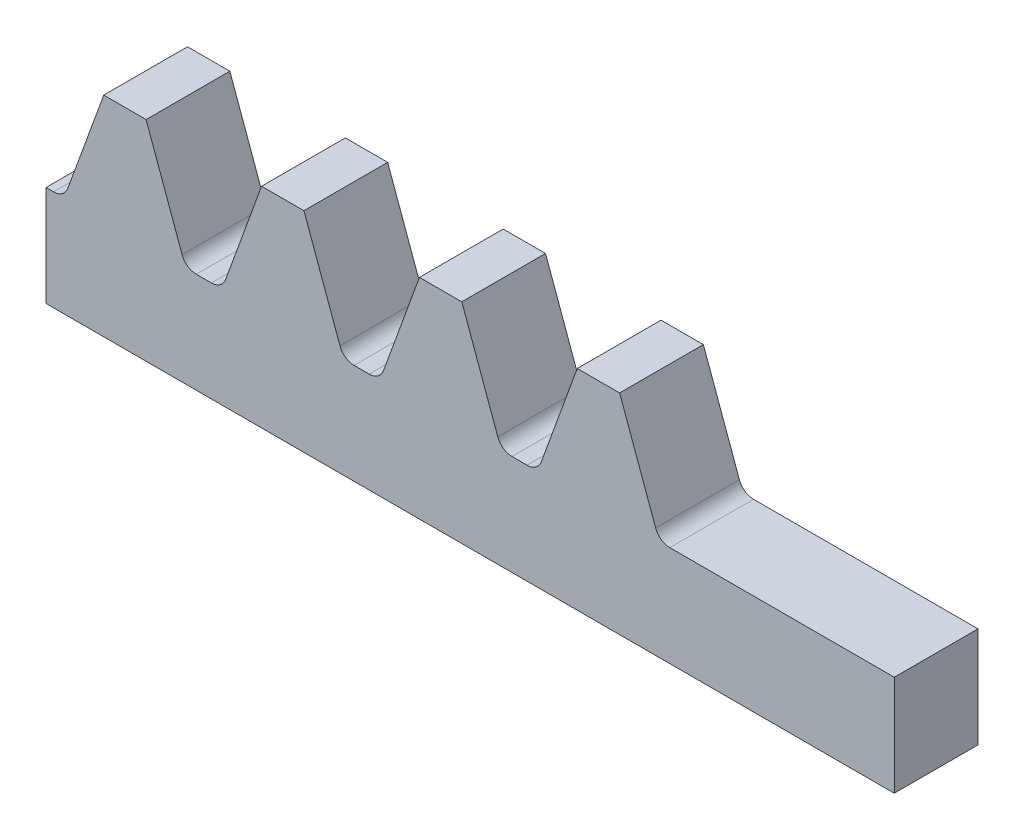
ISO-10303-21;
HEADER;
FILE_DESCRIPTION(('STEP AP214'),'2;1');
FILE_NAME('part.step','',(''),(''),'','','');
FILE_SCHEMA(('AUTOMOTIVE_DESIGN { 1 0 10303 214 1 1 1 1 }'));
ENDSEC;
DATA;
#1=APPLICATION_CONTEXT('core data for automotive mechanical design processes');
#2=APPLICATION_PROTOCOL_DEFINITION('international standard','automotive_design',2000,#1);
#3=PRODUCT_CONTEXT('',#1,'mechanical');
#4=PRODUCT('Part','Part','',(#3));
#5=PRODUCT_RELATED_PRODUCT_CATEGORY('part','',(#4));
#6=PRODUCT_DEFINITION_FORMATION('','',#4);
#7=PRODUCT_DEFINITION_CONTEXT('part definition',#1,'design');
#8=PRODUCT_DEFINITION('design','',#6,#7);
#9=PRODUCT_DEFINITION_SHAPE('','',#8);
#10=(LENGTH_UNIT() NAMED_UNIT(*) SI_UNIT(.MILLI.,.METRE.));
#11=(NAMED_UNIT(*) PLANE_ANGLE_UNIT() SI_UNIT($,.RADIAN.));
#12=(NAMED_UNIT(*) SI_UNIT($,.STERADIAN.) SOLID_ANGLE_UNIT());
#13=UNCERTAINTY_MEASURE_WITH_UNIT(LENGTH_MEASURE(1.E-05),#10,'distance_accuracy_value','');
#14=(GEOMETRIC_REPRESENTATION_CONTEXT(3) GLOBAL_UNCERTAINTY_ASSIGNED_CONTEXT((#13)) GLOBAL_UNIT_ASSIGNED_CONTEXT((#10,
#11,#12)) REPRESENTATION_CONTEXT('',''));
#15=CARTESIAN_POINT('',(0.,0.,0.));
#16=DIRECTION('',(0.,0.,1.));
#17=DIRECTION('',(1.,0.,0.));
#18=AXIS2_PLACEMENT_3D('',#15,#16,#17);
#19=CARTESIAN_POINT('',(111.771393149109,12.,10.));
#20=DIRECTION('',(0.,-1.,0.));
#21=DIRECTION('',(1.,0.,0.));
#22=AXIS2_PLACEMENT_3D('',#19,#20,#21);
#23=PLANE('',#22);
#24=DIRECTION('',(-1.,0.,0.));
#25=VECTOR('',#24,1.);
#26=CARTESIAN_POINT('',(111.771393149109,12.,0.));
#27=LINE('',#26,#25);
#28=CARTESIAN_POINT('',(138.578606850891,12.,0.));
#29=VERTEX_POINT('',#28);
#30=CARTESIAN_POINT('',(111.771393149109,12.,0.));
#31=VERTEX_POINT('',#30);
#32=EDGE_CURVE('E148',#29,#31,#27,.T.);
#33=ORIENTED_EDGE('',*,*,#32,.T.);
#34=DIRECTION('',(0.,0.,-1.));
#35=VECTOR('',#34,1.);
#36=CARTESIAN_POINT('',(111.771393149109,12.,10.));
#37=LINE('',#36,#35);
#38=CARTESIAN_POINT('',(111.771393149109,12.,10.));
#39=VERTEX_POINT('',#38);
#40=EDGE_CURVE('E11',#39,#31,#37,.T.);
#41=ORIENTED_EDGE('',*,*,#40,.F.);
#42=DIRECTION('',(-1.,0.,0.));
#43=VECTOR('',#42,1.);
#44=CARTESIAN_POINT('',(113.578606850891,12.,10.));
#45=LINE('',#44,#43);
#46=CARTESIAN_POINT('',(138.578606850891,12.,10.));
#47=VERTEX_POINT('',#46);
#48=EDGE_CURVE('E154',#47,#39,#45,.T.);
#49=ORIENTED_EDGE('',*,*,#48,.F.);
#50=DIRECTION('',(0.,0.,-1.));
#51=VECTOR('',#50,1.);
#52=CARTESIAN_POINT('',(138.578606850891,12.,10.));
#53=LINE('',#52,#51);
#54=EDGE_CURVE('E248',#47,#29,#53,.T.);
#55=ORIENTED_EDGE('',*,*,#54,.T.);
#56=EDGE_LOOP('',(#33,#41,#49,#55));
#57=FACE_BOUND('',#56,.T.);
#58=ADVANCED_FACE('F36',(#57),#23,.F.);
#59=CARTESIAN_POINT('',(111.771393149109,13.8,10.));
#60=DIRECTION('',(0.,0.,-1.));
#61=DIRECTION('',(-1.,0.,0.));
#62=AXIS2_PLACEMENT_3D('',#59,#60,#61);
#63=CYLINDRICAL_SURFACE('',#62,1.79999999999999);
#64=CARTESIAN_POINT('',(111.771393149109,13.8,0.));
#65=DIRECTION('',(0.,0.,-1.));
#66=DIRECTION('',(1.,0.,0.));
#67=AXIS2_PLACEMENT_3D('',#64,#65,#66);
#68=CIRCLE('',#67,1.79999999999999);
#69=CARTESIAN_POINT('',(110.079946431695,13.1843637420138,0.));
#70=VERTEX_POINT('',#69);
#71=EDGE_CURVE('E253',#31,#70,#68,.T.);
#72=ORIENTED_EDGE('',*,*,#71,.T.);
#73=DIRECTION('',(0.,0.,-1.));
#74=VECTOR('',#73,1.);
#75=CARTESIAN_POINT('',(110.079946431695,13.1843637420138,10.));
#76=LINE('',#75,#74);
#77=CARTESIAN_POINT('',(110.079946431695,13.1843637420138,10.));
#78=VERTEX_POINT('',#77);
#79=EDGE_CURVE('E44',#78,#70,#76,.T.);
#80=ORIENTED_EDGE('',*,*,#79,.F.);
#81=CARTESIAN_POINT('',(111.771393149109,13.8,10.));
#82=DIRECTION('',(0.,0.,-1.));
#83=DIRECTION('',(1.,0.,0.));
#84=AXIS2_PLACEMENT_3D('',#81,#82,#83);
#85=CIRCLE('',#84,1.79999999999999);
#86=EDGE_CURVE('E453',#39,#78,#85,.T.);
#87=ORIENTED_EDGE('',*,*,#86,.F.);
#88=ORIENTED_EDGE('',*,*,#40,.T.);
#89=EDGE_LOOP('',(#72,#80,#87,#88));
#90=FACE_BOUND('',#89,.T.);
#91=ADVANCED_FACE('F456',(#90),#63,.F.);
#92=CARTESIAN_POINT('',(105.778678594403,25.002,10.));
#93=DIRECTION('',(-0.93969262078591,-0.342020143325664,0.));
#94=DIRECTION('',(0.342020143325664,-0.93969262078591,0.));
#95=AXIS2_PLACEMENT_3D('',#92,#93,#94);
#96=PLANE('',#95);
#97=DIRECTION('',(-0.342020143325664,0.93969262078591,0.));
#98=VECTOR('',#97,1.);
#99=CARTESIAN_POINT('',(105.778678594403,25.002,0.));
#100=LINE('',#99,#98);
#101=CARTESIAN_POINT('',(105.778678594403,25.002,0.));
#102=VERTEX_POINT('',#101);
#103=EDGE_CURVE('E255',#70,#102,#100,.T.);
#104=ORIENTED_EDGE('',*,*,#103,.T.);
#105=DIRECTION('',(0.,0.,-1.));
#106=VECTOR('',#105,1.);
#107=CARTESIAN_POINT('',(105.778678594403,25.002,10.));
#108=LINE('',#107,#106);
#109=CARTESIAN_POINT('',(105.778678594403,25.002,10.));
#110=VERTEX_POINT('',#109);
#111=EDGE_CURVE('E372',#110,#102,#108,.T.);
#112=ORIENTED_EDGE('',*,*,#111,.F.);
#113=DIRECTION('',(-0.342020143325664,0.93969262078591,0.));
#114=VECTOR('',#113,1.);
#115=CARTESIAN_POINT('',(105.778678594403,25.002,10.));
#116=LINE('',#115,#114);
#117=EDGE_CURVE('E381',#78,#110,#116,.T.);
#118=ORIENTED_EDGE('',*,*,#117,.F.);
#119=ORIENTED_EDGE('',*,*,#79,.T.);
#120=EDGE_LOOP('',(#104,#112,#118,#119));
#121=FACE_BOUND('',#120,.T.);
#122=ADVANCED_FACE('F379',(#121),#96,.F.);
#123=CARTESIAN_POINT('',(100.721321405597,25.002,10.));
#124=DIRECTION('',(0.,-1.,0.));
#125=DIRECTION('',(1.,0.,0.));
#126=AXIS2_PLACEMENT_3D('',#123,#124,#125);
#127=PLANE('',#126);
#128=DIRECTION('',(-1.,0.,0.));
#129=VECTOR('',#128,1.);
#130=CARTESIAN_POINT('',(100.721321405597,25.002,0.));
#131=LINE('',#130,#129);
#132=CARTESIAN_POINT('',(100.721321405597,25.002,0.));
#133=VERTEX_POINT('',#132);
#134=EDGE_CURVE('E257',#102,#133,#131,.T.);
#135=ORIENTED_EDGE('',*,*,#134,.T.);
#136=DIRECTION('',(0.,0.,-1.));
#137=VECTOR('',#136,1.);
#138=CARTESIAN_POINT('',(100.721321405597,25.002,10.));
#139=LINE('',#138,#137);
#140=CARTESIAN_POINT('',(100.721321405597,25.002,10.));
#141=VERTEX_POINT('',#140);
#142=EDGE_CURVE('E369',#141,#133,#139,.T.);
#143=ORIENTED_EDGE('',*,*,#142,.F.);
#144=DIRECTION('',(-1.,0.,0.));
#145=VECTOR('',#144,1.);
#146=CARTESIAN_POINT('',(100.721321405597,25.002,10.));
#147=LINE('',#146,#145);
#148=EDGE_CURVE('E399',#110,#141,#147,.T.);
#149=ORIENTED_EDGE('',*,*,#148,.F.);
#150=ORIENTED_EDGE('',*,*,#111,.T.);
#151=EDGE_LOOP('',(#135,#143,#149,#150));
#152=FACE_BOUND('',#151,.T.);
#153=ADVANCED_FACE('F390',(#152),#127,.F.);
#154=CARTESIAN_POINT('',(100.721321405597,25.002,10.));
#155=DIRECTION('',(0.93969262078591,-0.342020143325664,0.));
#156=DIRECTION('',(0.342020143325664,0.93969262078591,0.));
#157=AXIS2_PLACEMENT_3D('',#154,#155,#156);
#158=PLANE('',#157);
#159=DIRECTION('',(-0.342020143325664,-0.93969262078591,0.));
#160=VECTOR('',#159,1.);
#161=CARTESIAN_POINT('',(100.721321405597,25.002,0.));
#162=LINE('',#161,#160);
#163=CARTESIAN_POINT('',(96.4200535683052,13.1843637420138,0.));
#164=VERTEX_POINT('',#163);
#165=EDGE_CURVE('E259',#133,#164,#162,.T.);
#166=ORIENTED_EDGE('',*,*,#165,.T.);
#167=DIRECTION('',(0.,0.,-1.));
#168=VECTOR('',#167,1.);
#169=CARTESIAN_POINT('',(96.4200535683052,13.1843637420138,10.));
#170=LINE('',#169,#168);
#171=CARTESIAN_POINT('',(96.4200535683052,13.1843637420138,10.));
#172=VERTEX_POINT('',#171);
#173=EDGE_CURVE('E366',#172,#164,#170,.T.);
#174=ORIENTED_EDGE('',*,*,#173,.F.);
#175=DIRECTION('',(-0.342020143325664,-0.93969262078591,0.));
#176=VECTOR('',#175,1.);
#177=CARTESIAN_POINT('',(100.721321405597,25.002,10.));
#178=LINE('',#177,#176);
#179=EDGE_CURVE('E396',#141,#172,#178,.T.);
#180=ORIENTED_EDGE('',*,*,#179,.F.);
#181=ORIENTED_EDGE('',*,*,#142,.T.);
#182=EDGE_LOOP('',(#166,#174,#180,#181));
#183=FACE_BOUND('',#182,.T.);
#184=ADVANCED_FACE('F394',(#183),#158,.F.);
#185=CARTESIAN_POINT('',(94.7286068508906,13.8,10.));
#186=DIRECTION('',(0.,0.,-1.));
#187=DIRECTION('',(-1.,0.,0.));
#188=AXIS2_PLACEMENT_3D('',#185,#186,#187);
#189=CYLINDRICAL_SURFACE('',#188,1.8);
#190=CARTESIAN_POINT('',(94.7286068508906,13.8,0.));
#191=DIRECTION('',(0.,0.,-1.));
#192=DIRECTION('',(-1.,0.,0.));
#193=AXIS2_PLACEMENT_3D('',#190,#191,#192);
#194=CIRCLE('',#193,1.8);
#195=CARTESIAN_POINT('',(94.7286068508906,12.,0.));
#196=VERTEX_POINT('',#195);
#197=EDGE_CURVE('E261',#164,#196,#194,.T.);
#198=ORIENTED_EDGE('',*,*,#197,.T.);
#199=DIRECTION('',(0.,0.,-1.));
#200=VECTOR('',#199,1.);
#201=CARTESIAN_POINT('',(94.7286068508906,12.,10.));
#202=LINE('',#201,#200);
#203=CARTESIAN_POINT('',(94.7286068508906,12.,10.));
#204=VERTEX_POINT('',#203);
#205=EDGE_CURVE('E363',#204,#196,#202,.T.);
#206=ORIENTED_EDGE('',*,*,#205,.F.);
#207=CARTESIAN_POINT('',(94.7286068508906,13.8,10.));
#208=DIRECTION('',(0.,0.,-1.));
#209=DIRECTION('',(-1.,0.,0.));
#210=AXIS2_PLACEMENT_3D('',#207,#208,#209);
#211=CIRCLE('',#210,1.8);
#212=EDGE_CURVE('E398',#172,#204,#211,.T.);
#213=ORIENTED_EDGE('',*,*,#212,.F.);
#214=ORIENTED_EDGE('',*,*,#173,.T.);
#215=EDGE_LOOP('',(#198,#206,#213,#214));
#216=FACE_BOUND('',#215,.T.);
#217=ADVANCED_FACE('F468',(#216),#189,.F.);
#218=CARTESIAN_POINT('',(92.9213931491094,12.,10.));
#219=DIRECTION('',(0.,-1.,0.));
#220=DIRECTION('',(1.,0.,0.));
#221=AXIS2_PLACEMENT_3D('',#218,#219,#220);
#222=PLANE('',#221);
#223=DIRECTION('',(-1.,0.,0.));
#224=VECTOR('',#223,1.);
#225=CARTESIAN_POINT('',(92.9213931491094,12.,0.));
#226=LINE('',#225,#224);
#227=CARTESIAN_POINT('',(92.9213931491094,12.,0.));
#228=VERTEX_POINT('',#227);
#229=EDGE_CURVE('E263',#196,#228,#226,.T.);
#230=ORIENTED_EDGE('',*,*,#229,.T.);
#231=DIRECTION('',(0.,0.,-1.));
#232=VECTOR('',#231,1.);
#233=CARTESIAN_POINT('',(92.9213931491094,12.,10.));
#234=LINE('',#233,#232);
#235=CARTESIAN_POINT('',(92.9213931491094,12.,10.));
#236=VERTEX_POINT('',#235);
#237=EDGE_CURVE('E360',#236,#228,#234,.T.);
#238=ORIENTED_EDGE('',*,*,#237,.F.);
#239=DIRECTION('',(-1.,0.,0.));
#240=VECTOR('',#239,1.);
#241=CARTESIAN_POINT('',(92.9213931491094,12.,10.));
#242=LINE('',#241,#240);
#243=EDGE_CURVE('E401',#204,#236,#242,.T.);
#244=ORIENTED_EDGE('',*,*,#243,.F.);
#245=ORIENTED_EDGE('',*,*,#205,.T.);
#246=EDGE_LOOP('',(#230,#238,#244,#245));
#247=FACE_BOUND('',#246,.T.);
#248=ADVANCED_FACE('F471',(#247),#222,.F.);
#249=CARTESIAN_POINT('',(92.9213931491094,13.8,10.));
#250=DIRECTION('',(0.,0.,-1.));
#251=DIRECTION('',(-1.,0.,0.));
#252=AXIS2_PLACEMENT_3D('',#249,#250,#251);
#253=CYLINDRICAL_SURFACE('',#252,1.79999999999999);
#254=CARTESIAN_POINT('',(92.9213931491094,13.8,0.));
#255=DIRECTION('',(0.,0.,-1.));
#256=DIRECTION('',(1.,0.,0.));
#257=AXIS2_PLACEMENT_3D('',#254,#255,#256);
#258=CIRCLE('',#257,1.79999999999999);
#259=CARTESIAN_POINT('',(91.2299464316947,13.1843637420138,0.));
#260=VERTEX_POINT('',#259);
#261=EDGE_CURVE('E265',#228,#260,#258,.T.);
#262=ORIENTED_EDGE('',*,*,#261,.T.);
#263=DIRECTION('',(0.,0.,-1.));
#264=VECTOR('',#263,1.);
#265=CARTESIAN_POINT('',(91.2299464316947,13.1843637420138,10.));
#266=LINE('',#265,#264);
#267=CARTESIAN_POINT('',(91.2299464316947,13.1843637420138,10.));
#268=VERTEX_POINT('',#267);
#269=EDGE_CURVE('E357',#268,#260,#266,.T.);
#270=ORIENTED_EDGE('',*,*,#269,.F.);
#271=CARTESIAN_POINT('',(92.9213931491094,13.8,10.));
#272=DIRECTION('',(0.,0.,-1.));
#273=DIRECTION('',(1.,0.,0.));
#274=AXIS2_PLACEMENT_3D('',#271,#272,#273);
#275=CIRCLE('',#274,1.79999999999999);
#276=EDGE_CURVE('E407',#236,#268,#275,.T.);
#277=ORIENTED_EDGE('',*,*,#276,.F.);
#278=ORIENTED_EDGE('',*,*,#237,.T.);
#279=EDGE_LOOP('',(#262,#270,#277,#278));
#280=FACE_BOUND('',#279,.T.);
#281=ADVANCED_FACE('F475',(#280),#253,.F.);
#282=CARTESIAN_POINT('',(86.9286785944028,25.002,10.));
#283=DIRECTION('',(-0.93969262078591,-0.342020143325664,0.));
#284=DIRECTION('',(0.342020143325664,-0.93969262078591,0.));
#285=AXIS2_PLACEMENT_3D('',#282,#283,#284);
#286=PLANE('',#285);
#287=DIRECTION('',(-0.342020143325664,0.93969262078591,0.));
#288=VECTOR('',#287,1.);
#289=CARTESIAN_POINT('',(86.9286785944028,25.002,0.));
#290=LINE('',#289,#288);
#291=CARTESIAN_POINT('',(86.9286785944028,25.002,0.));
#292=VERTEX_POINT('',#291);
#293=EDGE_CURVE('E267',#260,#292,#290,.T.);
#294=ORIENTED_EDGE('',*,*,#293,.T.);
#295=DIRECTION('',(0.,0.,-1.));
#296=VECTOR('',#295,1.);
#297=CARTESIAN_POINT('',(86.9286785944028,25.002,10.));
#298=LINE('',#297,#296);
#299=CARTESIAN_POINT('',(86.9286785944028,25.002,10.));
#300=VERTEX_POINT('',#299);
#301=EDGE_CURVE('E354',#300,#292,#298,.T.);
#302=ORIENTED_EDGE('',*,*,#301,.F.);
#303=DIRECTION('',(-0.342020143325664,0.93969262078591,0.));
#304=VECTOR('',#303,1.);
#305=CARTESIAN_POINT('',(86.9286785944028,25.002,10.));
#306=LINE('',#305,#304);
#307=EDGE_CURVE('E409',#268,#300,#306,.T.);
#308=ORIENTED_EDGE('',*,*,#307,.F.);
#309=ORIENTED_EDGE('',*,*,#269,.T.);
#310=EDGE_LOOP('',(#294,#302,#308,#309));
#311=FACE_BOUND('',#310,.T.);
#312=ADVANCED_FACE('F479',(#311),#286,.F.);
#313=CARTESIAN_POINT('',(81.8713214055972,25.002,10.));
#314=DIRECTION('',(0.,-1.,0.));
#315=DIRECTION('',(1.,0.,0.));
#316=AXIS2_PLACEMENT_3D('',#313,#314,#315);
#317=PLANE('',#316);
#318=DIRECTION('',(-1.,0.,0.));
#319=VECTOR('',#318,1.);
#320=CARTESIAN_POINT('',(81.8713214055972,25.002,0.));
#321=LINE('',#320,#319);
#322=CARTESIAN_POINT('',(81.8713214055972,25.002,0.));
#323=VERTEX_POINT('',#322);
#324=EDGE_CURVE('E269',#292,#323,#321,.T.);
#325=ORIENTED_EDGE('',*,*,#324,.T.);
#326=DIRECTION('',(0.,0.,-1.));
#327=VECTOR('',#326,1.);
#328=CARTESIAN_POINT('',(81.8713214055972,25.002,10.));
#329=LINE('',#328,#327);
#330=CARTESIAN_POINT('',(81.8713214055972,25.002,10.));
#331=VERTEX_POINT('',#330);
#332=EDGE_CURVE('E351',#331,#323,#329,.T.);
#333=ORIENTED_EDGE('',*,*,#332,.F.);
#334=DIRECTION('',(-1.,0.,0.));
#335=VECTOR('',#334,1.);
#336=CARTESIAN_POINT('',(81.8713214055972,25.002,10.));
#337=LINE('',#336,#335);
#338=EDGE_CURVE('E411',#300,#331,#337,.T.);
#339=ORIENTED_EDGE('',*,*,#338,.F.);
#340=ORIENTED_EDGE('',*,*,#301,.T.);
#341=EDGE_LOOP('',(#325,#333,#339,#340));
#342=FACE_BOUND('',#341,.T.);
#343=ADVANCED_FACE('F483',(#342),#317,.F.);
#344=CARTESIAN_POINT('',(81.8713214055972,25.002,10.));
#345=DIRECTION('',(0.93969262078591,-0.342020143325664,0.));
#346=DIRECTION('',(0.342020143325664,0.93969262078591,0.));
#347=AXIS2_PLACEMENT_3D('',#344,#345,#346);
#348=PLANE('',#347);
#349=DIRECTION('',(-0.342020143325664,-0.93969262078591,0.));
#350=VECTOR('',#349,1.);
#351=CARTESIAN_POINT('',(81.8713214055972,25.002,0.));
#352=LINE('',#351,#350);
#353=CARTESIAN_POINT('',(77.5700535683052,13.1843637420138,0.));
#354=VERTEX_POINT('',#353);
#355=EDGE_CURVE('E271',#323,#354,#352,.T.);
#356=ORIENTED_EDGE('',*,*,#355,.T.);
#357=DIRECTION('',(0.,0.,-1.));
#358=VECTOR('',#357,1.);
#359=CARTESIAN_POINT('',(77.5700535683052,13.1843637420138,10.));
#360=LINE('',#359,#358);
#361=CARTESIAN_POINT('',(77.5700535683052,13.1843637420138,10.));
#362=VERTEX_POINT('',#361);
#363=EDGE_CURVE('E348',#362,#354,#360,.T.);
#364=ORIENTED_EDGE('',*,*,#363,.F.);
#365=DIRECTION('',(-0.342020143325664,-0.93969262078591,0.));
#366=VECTOR('',#365,1.);
#367=CARTESIAN_POINT('',(81.8713214055972,25.002,10.));
#368=LINE('',#367,#366);
#369=EDGE_CURVE('E413',#331,#362,#368,.T.);
#370=ORIENTED_EDGE('',*,*,#369,.F.);
#371=ORIENTED_EDGE('',*,*,#332,.T.);
#372=EDGE_LOOP('',(#356,#364,#370,#371));
#373=FACE_BOUND('',#372,.T.);
#374=ADVANCED_FACE('F487',(#373),#348,.F.);
#375=CARTESIAN_POINT('',(75.8786068508906,13.8,10.));
#376=DIRECTION('',(0.,0.,-1.));
#377=DIRECTION('',(-1.,0.,0.));
#378=AXIS2_PLACEMENT_3D('',#375,#376,#377);
#379=CYLINDRICAL_SURFACE('',#378,1.8);
#380=CARTESIAN_POINT('',(75.8786068508906,13.8,0.));
#381=DIRECTION('',(0.,0.,-1.));
#382=DIRECTION('',(-1.,0.,0.));
#383=AXIS2_PLACEMENT_3D('',#380,#381,#382);
#384=CIRCLE('',#383,1.8);
#385=CARTESIAN_POINT('',(75.8786068508906,12.,0.));
#386=VERTEX_POINT('',#385);
#387=EDGE_CURVE('E273',#354,#386,#384,.T.);
#388=ORIENTED_EDGE('',*,*,#387,.T.);
#389=DIRECTION('',(0.,0.,-1.));
#390=VECTOR('',#389,1.);
#391=CARTESIAN_POINT('',(75.8786068508906,12.,10.));
#392=LINE('',#391,#390);
#393=CARTESIAN_POINT('',(75.8786068508906,12.,10.));
#394=VERTEX_POINT('',#393);
#395=EDGE_CURVE('E345',#394,#386,#392,.T.);
#396=ORIENTED_EDGE('',*,*,#395,.F.);
#397=CARTESIAN_POINT('',(75.8786068508906,13.8,10.));
#398=DIRECTION('',(0.,0.,-1.));
#399=DIRECTION('',(-1.,0.,0.));
#400=AXIS2_PLACEMENT_3D('',#397,#398,#399);
#401=CIRCLE('',#400,1.8);
#402=EDGE_CURVE('E415',#362,#394,#401,.T.);
#403=ORIENTED_EDGE('',*,*,#402,.F.);
#404=ORIENTED_EDGE('',*,*,#363,.T.);
#405=EDGE_LOOP('',(#388,#396,#403,#404));
#406=FACE_BOUND('',#405,.T.);
#407=ADVANCED_FACE('F491',(#406),#379,.F.);
#408=CARTESIAN_POINT('',(74.0713931491094,12.,10.));
#409=DIRECTION('',(0.,-1.,0.));
#410=DIRECTION('',(1.,0.,0.));
#411=AXIS2_PLACEMENT_3D('',#408,#409,#410);
#412=PLANE('',#411);
#413=DIRECTION('',(-1.,0.,0.));
#414=VECTOR('',#413,1.);
#415=CARTESIAN_POINT('',(74.0713931491094,12.,0.));
#416=LINE('',#415,#414);
#417=CARTESIAN_POINT('',(74.0713931491094,12.,0.));
#418=VERTEX_POINT('',#417);
#419=EDGE_CURVE('E275',#386,#418,#416,.T.);
#420=ORIENTED_EDGE('',*,*,#419,.T.);
#421=DIRECTION('',(0.,0.,-1.));
#422=VECTOR('',#421,1.);
#423=CARTESIAN_POINT('',(74.0713931491094,12.,10.));
#424=LINE('',#423,#422);
#425=CARTESIAN_POINT('',(74.0713931491094,12.,10.));
#426=VERTEX_POINT('',#425);
#427=EDGE_CURVE('E342',#426,#418,#424,.T.);
#428=ORIENTED_EDGE('',*,*,#427,.F.);
#429=DIRECTION('',(-1.,0.,0.));
#430=VECTOR('',#429,1.);
#431=CARTESIAN_POINT('',(74.0713931491094,12.,10.));
#432=LINE('',#431,#430);
#433=EDGE_CURVE('E417',#394,#426,#432,.T.);
#434=ORIENTED_EDGE('',*,*,#433,.F.);
#435=ORIENTED_EDGE('',*,*,#395,.T.);
#436=EDGE_LOOP('',(#420,#428,#434,#435));
#437=FACE_BOUND('',#436,.T.);
#438=ADVANCED_FACE('F495',(#437),#412,.F.);
#439=CARTESIAN_POINT('',(74.0713931491094,13.8,10.));
#440=DIRECTION('',(0.,0.,-1.));
#441=DIRECTION('',(-1.,0.,0.));
#442=AXIS2_PLACEMENT_3D('',#439,#440,#441);
#443=CYLINDRICAL_SURFACE('',#442,1.8);
#444=CARTESIAN_POINT('',(74.0713931491094,13.8,0.));
#445=DIRECTION('',(0.,0.,-1.));
#446=DIRECTION('',(1.,0.,0.));
#447=AXIS2_PLACEMENT_3D('',#444,#445,#446);
#448=CIRCLE('',#447,1.8);
#449=CARTESIAN_POINT('',(72.3799464316947,13.1843637420138,0.));
#450=VERTEX_POINT('',#449);
#451=EDGE_CURVE('E277',#418,#450,#448,.T.);
#452=ORIENTED_EDGE('',*,*,#451,.T.);
#453=DIRECTION('',(0.,0.,-1.));
#454=VECTOR('',#453,1.);
#455=CARTESIAN_POINT('',(72.3799464316947,13.1843637420138,10.));
#456=LINE('',#455,#454);
#457=CARTESIAN_POINT('',(72.3799464316947,13.1843637420138,10.));
#458=VERTEX_POINT('',#457);
#459=EDGE_CURVE('E339',#458,#450,#456,.T.);
#460=ORIENTED_EDGE('',*,*,#459,.F.);
#461=CARTESIAN_POINT('',(74.0713931491094,13.8,10.));
#462=DIRECTION('',(0.,0.,-1.));
#463=DIRECTION('',(1.,0.,0.));
#464=AXIS2_PLACEMENT_3D('',#461,#462,#463);
#465=CIRCLE('',#464,1.8);
#466=EDGE_CURVE('E419',#426,#458,#465,.T.);
#467=ORIENTED_EDGE('',*,*,#466,.F.);
#468=ORIENTED_EDGE('',*,*,#427,.T.);
#469=EDGE_LOOP('',(#452,#460,#467,#468));
#470=FACE_BOUND('',#469,.T.);
#471=ADVANCED_FACE('F499',(#470),#443,.F.);
#472=CARTESIAN_POINT('',(68.0786785944028,25.002,10.));
#473=DIRECTION('',(-0.93969262078591,-0.342020143325663,0.));
#474=DIRECTION('',(0.342020143325663,-0.939692620785911,0.));
#475=AXIS2_PLACEMENT_3D('',#472,#473,#474);
#476=PLANE('',#475);
#477=DIRECTION('',(-0.342020143325663,0.939692620785911,0.));
#478=VECTOR('',#477,1.);
#479=CARTESIAN_POINT('',(68.0786785944028,25.002,0.));
#480=LINE('',#479,#478);
#481=CARTESIAN_POINT('',(68.0786785944028,25.002,0.));
#482=VERTEX_POINT('',#481);
#483=EDGE_CURVE('E279',#450,#482,#480,.T.);
#484=ORIENTED_EDGE('',*,*,#483,.T.);
#485=DIRECTION('',(0.,0.,-1.));
#486=VECTOR('',#485,1.);
#487=CARTESIAN_POINT('',(68.0786785944028,25.002,10.));
#488=LINE('',#487,#486);
#489=CARTESIAN_POINT('',(68.0786785944028,25.002,10.));
#490=VERTEX_POINT('',#489);
#491=EDGE_CURVE('E336',#490,#482,#488,.T.);
#492=ORIENTED_EDGE('',*,*,#491,.F.);
#493=DIRECTION('',(-0.342020143325663,0.939692620785911,0.));
#494=VECTOR('',#493,1.);
#495=CARTESIAN_POINT('',(68.0786785944028,25.002,10.));
#496=LINE('',#495,#494);
#497=EDGE_CURVE('E421',#458,#490,#496,.T.);
#498=ORIENTED_EDGE('',*,*,#497,.F.);
#499=ORIENTED_EDGE('',*,*,#459,.T.);
#500=EDGE_LOOP('',(#484,#492,#498,#499));
#501=FACE_BOUND('',#500,.T.);
#502=ADVANCED_FACE('F503',(#501),#476,.F.);
#503=CARTESIAN_POINT('',(63.0213214055972,25.002,10.));
#504=DIRECTION('',(0.,-1.,0.));
#505=DIRECTION('',(1.,0.,0.));
#506=AXIS2_PLACEMENT_3D('',#503,#504,#505);
#507=PLANE('',#506);
#508=DIRECTION('',(-1.,0.,0.));
#509=VECTOR('',#508,1.);
#510=CARTESIAN_POINT('',(63.0213214055972,25.002,0.));
#511=LINE('',#510,#509);
#512=CARTESIAN_POINT('',(63.0213214055972,25.002,0.));
#513=VERTEX_POINT('',#512);
#514=EDGE_CURVE('E281',#482,#513,#511,.T.);
#515=ORIENTED_EDGE('',*,*,#514,.T.);
#516=DIRECTION('',(0.,0.,-1.));
#517=VECTOR('',#516,1.);
#518=CARTESIAN_POINT('',(63.0213214055972,25.002,10.));
#519=LINE('',#518,#517);
#520=CARTESIAN_POINT('',(63.0213214055972,25.002,10.));
#521=VERTEX_POINT('',#520);
#522=EDGE_CURVE('E333',#521,#513,#519,.T.);
#523=ORIENTED_EDGE('',*,*,#522,.F.);
#524=DIRECTION('',(-1.,0.,0.));
#525=VECTOR('',#524,1.);
#526=CARTESIAN_POINT('',(63.0213214055972,25.002,10.));
#527=LINE('',#526,#525);
#528=EDGE_CURVE('E423',#490,#521,#527,.T.);
#529=ORIENTED_EDGE('',*,*,#528,.F.);
#530=ORIENTED_EDGE('',*,*,#491,.T.);
#531=EDGE_LOOP('',(#515,#523,#529,#530));
#532=FACE_BOUND('',#531,.T.);
#533=ADVANCED_FACE('F507',(#532),#507,.F.);
#534=CARTESIAN_POINT('',(63.0213214055972,25.002,10.));
#535=DIRECTION('',(0.939692620785911,-0.342020143325662,0.));
#536=DIRECTION('',(0.342020143325662,0.939692620785911,0.));
#537=AXIS2_PLACEMENT_3D('',#534,#535,#536);
#538=PLANE('',#537);
#539=DIRECTION('',(-0.342020143325662,-0.939692620785911,0.));
#540=VECTOR('',#539,1.);
#541=CARTESIAN_POINT('',(63.0213214055972,25.002,0.));
#542=LINE('',#541,#540);
#543=CARTESIAN_POINT('',(58.7200535683053,13.1843637420138,0.));
#544=VERTEX_POINT('',#543);
#545=EDGE_CURVE('E283',#513,#544,#542,.T.);
#546=ORIENTED_EDGE('',*,*,#545,.T.);
#547=DIRECTION('',(0.,0.,-1.));
#548=VECTOR('',#547,1.);
#549=CARTESIAN_POINT('',(58.7200535683053,13.1843637420138,10.));
#550=LINE('',#549,#548);
#551=CARTESIAN_POINT('',(58.7200535683053,13.1843637420138,10.));
#552=VERTEX_POINT('',#551);
#553=EDGE_CURVE('E330',#552,#544,#550,.T.);
#554=ORIENTED_EDGE('',*,*,#553,.F.);
#555=DIRECTION('',(-0.342020143325662,-0.939692620785911,0.));
#556=VECTOR('',#555,1.);
#557=CARTESIAN_POINT('',(63.0213214055972,25.002,10.));
#558=LINE('',#557,#556);
#559=EDGE_CURVE('E425',#521,#552,#558,.T.);
#560=ORIENTED_EDGE('',*,*,#559,.F.);
#561=ORIENTED_EDGE('',*,*,#522,.T.);
#562=EDGE_LOOP('',(#546,#554,#560,#561));
#563=FACE_BOUND('',#562,.T.);
#564=ADVANCED_FACE('F511',(#563),#538,.F.);
#565=CARTESIAN_POINT('',(57.0286068508906,13.8,10.));
#566=DIRECTION('',(0.,0.,-1.));
#567=DIRECTION('',(-1.,0.,0.));
#568=AXIS2_PLACEMENT_3D('',#565,#566,#567);
#569=CYLINDRICAL_SURFACE('',#568,1.8);
#570=CARTESIAN_POINT('',(57.0286068508906,13.8,0.));
#571=DIRECTION('',(0.,0.,-1.));
#572=DIRECTION('',(-1.,0.,0.));
#573=AXIS2_PLACEMENT_3D('',#570,#571,#572);
#574=CIRCLE('',#573,1.8);
#575=CARTESIAN_POINT('',(57.0286068508906,12.,0.));
#576=VERTEX_POINT('',#575);
#577=EDGE_CURVE('E285',#544,#576,#574,.T.);
#578=ORIENTED_EDGE('',*,*,#577,.T.);
#579=DIRECTION('',(0.,0.,-1.));
#580=VECTOR('',#579,1.);
#581=CARTESIAN_POINT('',(57.0286068508906,12.,10.));
#582=LINE('',#581,#580);
#583=CARTESIAN_POINT('',(57.0286068508906,12.,10.));
#584=VERTEX_POINT('',#583);
#585=EDGE_CURVE('E327',#584,#576,#582,.T.);
#586=ORIENTED_EDGE('',*,*,#585,.F.);
#587=CARTESIAN_POINT('',(57.0286068508906,13.8,10.));
#588=DIRECTION('',(0.,0.,-1.));
#589=DIRECTION('',(-1.,0.,0.));
#590=AXIS2_PLACEMENT_3D('',#587,#588,#589);
#591=CIRCLE('',#590,1.8);
#592=EDGE_CURVE('E427',#552,#584,#591,.T.);
#593=ORIENTED_EDGE('',*,*,#592,.F.);
#594=ORIENTED_EDGE('',*,*,#553,.T.);
#595=EDGE_LOOP('',(#578,#586,#593,#594));
#596=FACE_BOUND('',#595,.T.);
#597=ADVANCED_FACE('F515',(#596),#569,.F.);
#598=CARTESIAN_POINT('',(55.2213931491094,12.,10.));
#599=DIRECTION('',(0.,-1.,0.));
#600=DIRECTION('',(1.,0.,0.));
#601=AXIS2_PLACEMENT_3D('',#598,#599,#600);
#602=PLANE('',#601);
#603=DIRECTION('',(-1.,0.,0.));
#604=VECTOR('',#603,1.);
#605=CARTESIAN_POINT('',(55.2213931491094,12.,0.));
#606=LINE('',#605,#604);
#607=CARTESIAN_POINT('',(55.2213931491094,12.,0.));
#608=VERTEX_POINT('',#607);
#609=EDGE_CURVE('E287',#576,#608,#606,.T.);
#610=ORIENTED_EDGE('',*,*,#609,.T.);
#611=DIRECTION('',(0.,0.,-1.));
#612=VECTOR('',#611,1.);
#613=CARTESIAN_POINT('',(55.2213931491094,12.,10.));
#614=LINE('',#613,#612);
#615=CARTESIAN_POINT('',(55.2213931491094,12.,10.));
#616=VERTEX_POINT('',#615);
#617=EDGE_CURVE('E324',#616,#608,#614,.T.);
#618=ORIENTED_EDGE('',*,*,#617,.F.);
#619=DIRECTION('',(-1.,0.,0.));
#620=VECTOR('',#619,1.);
#621=CARTESIAN_POINT('',(55.2213931491094,12.,10.));
#622=LINE('',#621,#620);
#623=EDGE_CURVE('E429',#584,#616,#622,.T.);
#624=ORIENTED_EDGE('',*,*,#623,.F.);
#625=ORIENTED_EDGE('',*,*,#585,.T.);
#626=EDGE_LOOP('',(#610,#618,#624,#625));
#627=FACE_BOUND('',#626,.T.);
#628=ADVANCED_FACE('F519',(#627),#602,.F.);
#629=CARTESIAN_POINT('',(55.2213931491094,13.8,10.));
#630=DIRECTION('',(0.,0.,-1.));
#631=DIRECTION('',(-1.,0.,0.));
#632=AXIS2_PLACEMENT_3D('',#629,#630,#631);
#633=CYLINDRICAL_SURFACE('',#632,1.8);
#634=CARTESIAN_POINT('',(55.2213931491094,13.8,0.));
#635=DIRECTION('',(0.,0.,-1.));
#636=DIRECTION('',(1.,0.,0.));
#637=AXIS2_PLACEMENT_3D('',#634,#635,#636);
#638=CIRCLE('',#637,1.8);
#639=CARTESIAN_POINT('',(53.5299464316947,13.1843637420138,0.));
#640=VERTEX_POINT('',#639);
#641=EDGE_CURVE('E289',#608,#640,#638,.T.);
#642=ORIENTED_EDGE('',*,*,#641,.T.);
#643=DIRECTION('',(0.,0.,-1.));
#644=VECTOR('',#643,1.);
#645=CARTESIAN_POINT('',(53.5299464316947,13.1843637420138,10.));
#646=LINE('',#645,#644);
#647=CARTESIAN_POINT('',(53.5299464316947,13.1843637420138,10.));
#648=VERTEX_POINT('',#647);
#649=EDGE_CURVE('E321',#648,#640,#646,.T.);
#650=ORIENTED_EDGE('',*,*,#649,.F.);
#651=CARTESIAN_POINT('',(55.2213931491094,13.8,10.));
#652=DIRECTION('',(0.,0.,-1.));
#653=DIRECTION('',(1.,0.,0.));
#654=AXIS2_PLACEMENT_3D('',#651,#652,#653);
#655=CIRCLE('',#654,1.8);
#656=EDGE_CURVE('E431',#616,#648,#655,.T.);
#657=ORIENTED_EDGE('',*,*,#656,.F.);
#658=ORIENTED_EDGE('',*,*,#617,.T.);
#659=EDGE_LOOP('',(#642,#650,#657,#658));
#660=FACE_BOUND('',#659,.T.);
#661=ADVANCED_FACE('F523',(#660),#633,.F.);
#662=CARTESIAN_POINT('',(49.2286785944028,25.002,10.));
#663=DIRECTION('',(-0.93969262078591,-0.342020143325663,0.));
#664=DIRECTION('',(0.342020143325663,-0.93969262078591,0.));
#665=AXIS2_PLACEMENT_3D('',#662,#663,#664);
#666=PLANE('',#665);
#667=DIRECTION('',(-0.342020143325663,0.93969262078591,0.));
#668=VECTOR('',#667,1.);
#669=CARTESIAN_POINT('',(49.2286785944028,25.002,0.));
#670=LINE('',#669,#668);
#671=CARTESIAN_POINT('',(49.2286785944028,25.002,0.));
#672=VERTEX_POINT('',#671);
#673=EDGE_CURVE('E291',#640,#672,#670,.T.);
#674=ORIENTED_EDGE('',*,*,#673,.T.);
#675=DIRECTION('',(0.,0.,-1.));
#676=VECTOR('',#675,1.);
#677=CARTESIAN_POINT('',(49.2286785944028,25.002,10.));
#678=LINE('',#677,#676);
#679=CARTESIAN_POINT('',(49.2286785944028,25.002,10.));
#680=VERTEX_POINT('',#679);
#681=EDGE_CURVE('E318',#680,#672,#678,.T.);
#682=ORIENTED_EDGE('',*,*,#681,.F.);
#683=DIRECTION('',(-0.342020143325663,0.93969262078591,0.));
#684=VECTOR('',#683,1.);
#685=CARTESIAN_POINT('',(49.2286785944028,25.002,10.));
#686=LINE('',#685,#684);
#687=EDGE_CURVE('E433',#648,#680,#686,.T.);
#688=ORIENTED_EDGE('',*,*,#687,.F.);
#689=ORIENTED_EDGE('',*,*,#649,.T.);
#690=EDGE_LOOP('',(#674,#682,#688,#689));
#691=FACE_BOUND('',#690,.T.);
#692=ADVANCED_FACE('F527',(#691),#666,.F.);
#693=CARTESIAN_POINT('',(44.1713214055972,25.002,10.));
#694=DIRECTION('',(0.,-1.,0.));
#695=DIRECTION('',(1.,0.,0.));
#696=AXIS2_PLACEMENT_3D('',#693,#694,#695);
#697=PLANE('',#696);
#698=DIRECTION('',(-1.,0.,0.));
#699=VECTOR('',#698,1.);
#700=CARTESIAN_POINT('',(44.1713214055972,25.002,0.));
#701=LINE('',#700,#699);
#702=CARTESIAN_POINT('',(44.1713214055972,25.002,0.));
#703=VERTEX_POINT('',#702);
#704=EDGE_CURVE('E293',#672,#703,#701,.T.);
#705=ORIENTED_EDGE('',*,*,#704,.T.);
#706=DIRECTION('',(0.,0.,-1.));
#707=VECTOR('',#706,1.);
#708=CARTESIAN_POINT('',(44.1713214055972,25.002,10.));
#709=LINE('',#708,#707);
#710=CARTESIAN_POINT('',(44.1713214055972,25.002,10.));
#711=VERTEX_POINT('',#710);
#712=EDGE_CURVE('E315',#711,#703,#709,.T.);
#713=ORIENTED_EDGE('',*,*,#712,.F.);
#714=DIRECTION('',(-1.,0.,0.));
#715=VECTOR('',#714,1.);
#716=CARTESIAN_POINT('',(44.1713214055972,25.002,10.));
#717=LINE('',#716,#715);
#718=EDGE_CURVE('E435',#680,#711,#717,.T.);
#719=ORIENTED_EDGE('',*,*,#718,.F.);
#720=ORIENTED_EDGE('',*,*,#681,.T.);
#721=EDGE_LOOP('',(#705,#713,#719,#720));
#722=FACE_BOUND('',#721,.T.);
#723=ADVANCED_FACE('F531',(#722),#697,.F.);
#724=CARTESIAN_POINT('',(44.1713214055972,25.002,10.));
#725=DIRECTION('',(0.939692620785911,-0.342020143325663,0.));
#726=DIRECTION('',(0.342020143325663,0.939692620785911,0.));
#727=AXIS2_PLACEMENT_3D('',#724,#725,#726);
#728=PLANE('',#727);
#729=DIRECTION('',(-0.342020143325663,-0.939692620785911,0.));
#730=VECTOR('',#729,1.);
#731=CARTESIAN_POINT('',(44.1713214055972,25.002,0.));
#732=LINE('',#731,#730);
#733=CARTESIAN_POINT('',(39.8700535683053,13.1843637420138,0.));
#734=VERTEX_POINT('',#733);
#735=EDGE_CURVE('E295',#703,#734,#732,.T.);
#736=ORIENTED_EDGE('',*,*,#735,.T.);
#737=DIRECTION('',(0.,0.,-1.));
#738=VECTOR('',#737,1.);
#739=CARTESIAN_POINT('',(39.8700535683053,13.1843637420138,10.));
#740=LINE('',#739,#738);
#741=CARTESIAN_POINT('',(39.8700535683053,13.1843637420138,10.));
#742=VERTEX_POINT('',#741);
#743=EDGE_CURVE('E312',#742,#734,#740,.T.);
#744=ORIENTED_EDGE('',*,*,#743,.F.);
#745=DIRECTION('',(-0.342020143325663,-0.939692620785911,0.));
#746=VECTOR('',#745,1.);
#747=CARTESIAN_POINT('',(44.1713214055972,25.002,10.));
#748=LINE('',#747,#746);
#749=EDGE_CURVE('E437',#711,#742,#748,.T.);
#750=ORIENTED_EDGE('',*,*,#749,.F.);
#751=ORIENTED_EDGE('',*,*,#712,.T.);
#752=EDGE_LOOP('',(#736,#744,#750,#751));
#753=FACE_BOUND('',#752,.T.);
#754=ADVANCED_FACE('F535',(#753),#728,.F.);
#755=CARTESIAN_POINT('',(38.1786068508906,13.8,10.));
#756=DIRECTION('',(0.,0.,-1.));
#757=DIRECTION('',(-1.,0.,0.));
#758=AXIS2_PLACEMENT_3D('',#755,#756,#757);
#759=CYLINDRICAL_SURFACE('',#758,1.8);
#760=CARTESIAN_POINT('',(38.1786068508906,13.8,0.));
#761=DIRECTION('',(0.,0.,-1.));
#762=DIRECTION('',(-1.,0.,0.));
#763=AXIS2_PLACEMENT_3D('',#760,#761,#762);
#764=CIRCLE('',#763,1.8);
#765=CARTESIAN_POINT('',(38.1786068508906,12.,0.));
#766=VERTEX_POINT('',#765);
#767=EDGE_CURVE('E297',#734,#766,#764,.T.);
#768=ORIENTED_EDGE('',*,*,#767,.T.);
#769=DIRECTION('',(0.,0.,-1.));
#770=VECTOR('',#769,1.);
#771=CARTESIAN_POINT('',(38.1786068508906,12.,10.));
#772=LINE('',#771,#770);
#773=CARTESIAN_POINT('',(38.1786068508906,12.,10.));
#774=VERTEX_POINT('',#773);
#775=EDGE_CURVE('E309',#774,#766,#772,.T.);
#776=ORIENTED_EDGE('',*,*,#775,.F.);
#777=CARTESIAN_POINT('',(38.1786068508906,13.8,10.));
#778=DIRECTION('',(0.,0.,-1.));
#779=DIRECTION('',(-1.,0.,0.));
#780=AXIS2_PLACEMENT_3D('',#777,#778,#779);
#781=CIRCLE('',#780,1.8);
#782=EDGE_CURVE('E439',#742,#774,#781,.T.);
#783=ORIENTED_EDGE('',*,*,#782,.F.);
#784=ORIENTED_EDGE('',*,*,#743,.T.);
#785=EDGE_LOOP('',(#768,#776,#783,#784));
#786=FACE_BOUND('',#785,.T.);
#787=ADVANCED_FACE('F445',(#786),#759,.F.);
#788=CARTESIAN_POINT('',(37.275,12.,10.));
#789=DIRECTION('',(0.,-1.,0.));
#790=DIRECTION('',(1.,0.,0.));
#791=AXIS2_PLACEMENT_3D('',#788,#789,#790);
#792=PLANE('',#791);
#793=DIRECTION('',(-1.,0.,0.));
#794=VECTOR('',#793,1.);
#795=CARTESIAN_POINT('',(37.275,12.,0.));
#796=LINE('',#795,#794);
#797=CARTESIAN_POINT('',(37.275,12.,0.));
#798=VERTEX_POINT('',#797);
#799=EDGE_CURVE('E299',#766,#798,#796,.T.);
#800=ORIENTED_EDGE('',*,*,#799,.T.);
#801=DIRECTION('',(0.,0.,-1.));
#802=VECTOR('',#801,1.);
#803=CARTESIAN_POINT('',(37.275,12.,10.));
#804=LINE('',#803,#802);
#805=CARTESIAN_POINT('',(37.275,12.,10.));
#806=VERTEX_POINT('',#805);
#807=EDGE_CURVE('E243',#806,#798,#804,.T.);
#808=ORIENTED_EDGE('',*,*,#807,.F.);
#809=DIRECTION('',(-1.,0.,0.));
#810=VECTOR('',#809,1.);
#811=CARTESIAN_POINT('',(37.275,12.,10.));
#812=LINE('',#811,#810);
#813=EDGE_CURVE('E234',#774,#806,#812,.T.);
#814=ORIENTED_EDGE('',*,*,#813,.F.);
#815=ORIENTED_EDGE('',*,*,#775,.T.);
#816=EDGE_LOOP('',(#800,#808,#814,#815));
#817=FACE_BOUND('',#816,.T.);
#818=ADVANCED_FACE('F449',(#817),#792,.F.);
#819=CARTESIAN_POINT('',(37.275,12.,10.));
#820=DIRECTION('',(1.,0.,0.));
#821=DIRECTION('',(0.,1.,0.));
#822=AXIS2_PLACEMENT_3D('',#819,#820,#821);
#823=PLANE('',#822);
#824=DIRECTION('',(0.,-1.,0.));
#825=VECTOR('',#824,1.);
#826=CARTESIAN_POINT('',(37.275,12.,0.));
#827=LINE('',#826,#825);
#828=CARTESIAN_POINT('',(37.275,0.,0.));
#829=VERTEX_POINT('',#828);
#830=EDGE_CURVE('E242',#798,#829,#827,.T.);
#831=ORIENTED_EDGE('',*,*,#830,.T.);
#832=DIRECTION('',(0.,0.,-1.));
#833=VECTOR('',#832,1.);
#834=CARTESIAN_POINT('',(37.275,0.,10.));
#835=LINE('',#834,#833);
#836=CARTESIAN_POINT('',(37.275,0.,10.));
#837=VERTEX_POINT('',#836);
#838=EDGE_CURVE('E239',#837,#829,#835,.T.);
#839=ORIENTED_EDGE('',*,*,#838,.F.);
#840=DIRECTION('',(0.,-1.,0.));
#841=VECTOR('',#840,1.);
#842=CARTESIAN_POINT('',(37.275,12.,10.));
#843=LINE('',#842,#841);
#844=EDGE_CURVE('E228',#806,#837,#843,.T.);
#845=ORIENTED_EDGE('',*,*,#844,.F.);
#846=ORIENTED_EDGE('',*,*,#807,.T.);
#847=EDGE_LOOP('',(#831,#839,#845,#846));
#848=FACE_BOUND('',#847,.T.);
#849=ADVANCED_FACE('F240',(#848),#823,.F.);
#850=CARTESIAN_POINT('',(37.275,0.,10.));
#851=DIRECTION('',(0.,1.,0.));
#852=DIRECTION('',(-1.,0.,0.));
#853=AXIS2_PLACEMENT_3D('',#850,#851,#852);
#854=PLANE('',#853);
#855=DIRECTION('',(1.,0.,0.));
#856=VECTOR('',#855,1.);
#857=CARTESIAN_POINT('',(37.275,0.,0.));
#858=LINE('',#857,#856);
#859=CARTESIAN_POINT('',(138.578606850891,0.,0.));
#860=VERTEX_POINT('',#859);
#861=EDGE_CURVE('E141',#829,#860,#858,.T.);
#862=ORIENTED_EDGE('',*,*,#861,.T.);
#863=DIRECTION('',(0.,0.,-1.));
#864=VECTOR('',#863,1.);
#865=CARTESIAN_POINT('',(138.578606850891,0.,10.));
#866=LINE('',#865,#864);
#867=CARTESIAN_POINT('',(138.578606850891,0.,10.));
#868=VERTEX_POINT('',#867);
#869=EDGE_CURVE('E244',#868,#860,#866,.T.);
#870=ORIENTED_EDGE('',*,*,#869,.F.);
#871=DIRECTION('',(1.,0.,0.));
#872=VECTOR('',#871,1.);
#873=CARTESIAN_POINT('',(37.275,0.,10.));
#874=LINE('',#873,#872);
#875=EDGE_CURVE('E232',#837,#868,#874,.T.);
#876=ORIENTED_EDGE('',*,*,#875,.F.);
#877=ORIENTED_EDGE('',*,*,#838,.T.);
#878=EDGE_LOOP('',(#862,#870,#876,#877));
#879=FACE_BOUND('',#878,.T.);
#880=ADVANCED_FACE('F246',(#879),#854,.F.);
#881=CARTESIAN_POINT('',(138.578606850891,12.,10.));
#882=DIRECTION('',(-1.,0.,0.));
#883=DIRECTION('',(0.,-1.,0.));
#884=AXIS2_PLACEMENT_3D('',#881,#882,#883);
#885=PLANE('',#884);
#886=DIRECTION('',(0.,1.,0.));
#887=VECTOR('',#886,1.);
#888=CARTESIAN_POINT('',(138.578606850891,12.,0.));
#889=LINE('',#888,#887);
#890=EDGE_CURVE('E303',#860,#29,#889,.T.);
#891=ORIENTED_EDGE('',*,*,#890,.T.);
#892=ORIENTED_EDGE('',*,*,#54,.F.);
#893=DIRECTION('',(0.,1.,0.));
#894=VECTOR('',#893,1.);
#895=CARTESIAN_POINT('',(138.578606850891,12.,10.));
#896=LINE('',#895,#894);
#897=EDGE_CURVE('E52',#868,#47,#896,.T.);
#898=ORIENTED_EDGE('',*,*,#897,.F.);
#899=ORIENTED_EDGE('',*,*,#869,.T.);
#900=EDGE_LOOP('',(#891,#892,#898,#899));
#901=FACE_BOUND('',#900,.T.);
#902=ADVANCED_FACE('F451',(#901),#885,.F.);
#903=CARTESIAN_POINT('',(38.1786068508906,13.8,10.));
#904=DIRECTION('',(0.,0.,-1.));
#905=DIRECTION('',(-1.,0.,0.));
#906=AXIS2_PLACEMENT_3D('',#903,#904,#905);
#907=PLANE('',#906);
#908=ORIENTED_EDGE('',*,*,#48,.T.);
#909=ORIENTED_EDGE('',*,*,#86,.T.);
#910=ORIENTED_EDGE('',*,*,#117,.T.);
#911=ORIENTED_EDGE('',*,*,#148,.T.);
#912=ORIENTED_EDGE('',*,*,#179,.T.);
#913=ORIENTED_EDGE('',*,*,#212,.T.);
#914=ORIENTED_EDGE('',*,*,#243,.T.);
#915=ORIENTED_EDGE('',*,*,#276,.T.);
#916=ORIENTED_EDGE('',*,*,#307,.T.);
#917=ORIENTED_EDGE('',*,*,#338,.T.);
#918=ORIENTED_EDGE('',*,*,#369,.T.);
#919=ORIENTED_EDGE('',*,*,#402,.T.);
#920=ORIENTED_EDGE('',*,*,#433,.T.);
#921=ORIENTED_EDGE('',*,*,#466,.T.);
#922=ORIENTED_EDGE('',*,*,#497,.T.);
#923=ORIENTED_EDGE('',*,*,#528,.T.);
#924=ORIENTED_EDGE('',*,*,#559,.T.);
#925=ORIENTED_EDGE('',*,*,#592,.T.);
#926=ORIENTED_EDGE('',*,*,#623,.T.);
#927=ORIENTED_EDGE('',*,*,#656,.T.);
#928=ORIENTED_EDGE('',*,*,#687,.T.);
#929=ORIENTED_EDGE('',*,*,#718,.T.);
#930=ORIENTED_EDGE('',*,*,#749,.T.);
#931=ORIENTED_EDGE('',*,*,#782,.T.);
#932=ORIENTED_EDGE('',*,*,#813,.T.);
#933=ORIENTED_EDGE('',*,*,#844,.T.);
#934=ORIENTED_EDGE('',*,*,#875,.T.);
#935=ORIENTED_EDGE('',*,*,#897,.T.);
#936=EDGE_LOOP('',(#908,#909,#910,#911,#912,#913,#914,#915,#916,#917,#918,#919,#920,#921,#922,
#923,#924,#925,#926,#927,#928,#929,#930,#931,#932,#933,#934,#935));
#937=FACE_BOUND('',#936,.T.);
#938=ADVANCED_FACE('F230',(#937),#907,.F.);
#939=CARTESIAN_POINT('',(38.1786068508906,13.8,0.));
#940=DIRECTION('',(0.,0.,-1.));
#941=DIRECTION('',(-1.,0.,0.));
#942=AXIS2_PLACEMENT_3D('',#939,#940,#941);
#943=PLANE('',#942);
#944=ORIENTED_EDGE('',*,*,#32,.F.);
#945=ORIENTED_EDGE('',*,*,#890,.F.);
#946=ORIENTED_EDGE('',*,*,#861,.F.);
#947=ORIENTED_EDGE('',*,*,#830,.F.);
#948=ORIENTED_EDGE('',*,*,#799,.F.);
#949=ORIENTED_EDGE('',*,*,#767,.F.);
#950=ORIENTED_EDGE('',*,*,#735,.F.);
#951=ORIENTED_EDGE('',*,*,#704,.F.);
#952=ORIENTED_EDGE('',*,*,#673,.F.);
#953=ORIENTED_EDGE('',*,*,#641,.F.);
#954=ORIENTED_EDGE('',*,*,#609,.F.);
#955=ORIENTED_EDGE('',*,*,#577,.F.);
#956=ORIENTED_EDGE('',*,*,#545,.F.);
#957=ORIENTED_EDGE('',*,*,#514,.F.);
#958=ORIENTED_EDGE('',*,*,#483,.F.);
#959=ORIENTED_EDGE('',*,*,#451,.F.);
#960=ORIENTED_EDGE('',*,*,#419,.F.);
#961=ORIENTED_EDGE('',*,*,#387,.F.);
#962=ORIENTED_EDGE('',*,*,#355,.F.);
#963=ORIENTED_EDGE('',*,*,#324,.F.);
#964=ORIENTED_EDGE('',*,*,#293,.F.);
#965=ORIENTED_EDGE('',*,*,#261,.F.);
#966=ORIENTED_EDGE('',*,*,#229,.F.);
#967=ORIENTED_EDGE('',*,*,#197,.F.);
#968=ORIENTED_EDGE('',*,*,#165,.F.);
#969=ORIENTED_EDGE('',*,*,#134,.F.);
#970=ORIENTED_EDGE('',*,*,#103,.F.);
#971=ORIENTED_EDGE('',*,*,#71,.F.);
#972=EDGE_LOOP('',(#944,#945,#946,#947,#948,#949,#950,#951,#952,#953,#954,#955,#956,#957,#958,
#959,#960,#961,#962,#963,#964,#965,#966,#967,#968,#969,#970,#971));
#973=FACE_BOUND('',#972,.T.);
#974=ADVANCED_FACE('F385',(#973),#943,.T.);
#975=CLOSED_SHELL('',(#58,#91,#122,#153,#184,#217,#248,#281,#312,#343,#374,#407,#438,#471,#502,
#533,#564,#597,#628,#661,#692,#723,#754,#787,#818,#849,#880,#902,#938,#974));
#976=MANIFOLD_SOLID_BREP('B2',#975);
#977=ADVANCED_BREP_SHAPE_REPRESENTATION('',(#18,#976),#14);
#978=SHAPE_DEFINITION_REPRESENTATION(#9,#977);
ENDSEC;
END-ISO-10303-21;
